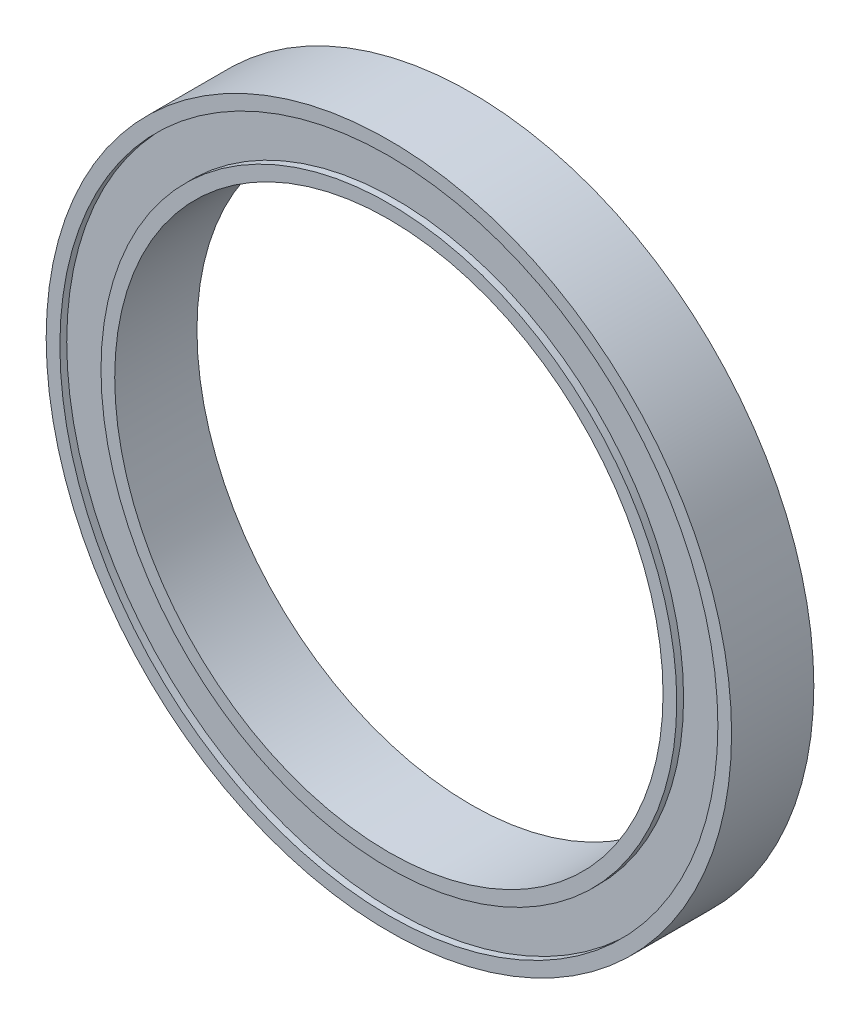
ISO-10303-21;
HEADER;
FILE_DESCRIPTION(('STEP AP214'),'2;1');
FILE_NAME('part.step','',(''),(''),'','','');
FILE_SCHEMA(('AUTOMOTIVE_DESIGN { 1 0 10303 214 1 1 1 1 }'));
ENDSEC;
DATA;
#1=APPLICATION_CONTEXT('core data for automotive mechanical design processes');
#2=APPLICATION_PROTOCOL_DEFINITION('international standard','automotive_design',2000,#1);
#3=PRODUCT_CONTEXT('',#1,'mechanical');
#4=PRODUCT('Part','Part','',(#3));
#5=PRODUCT_RELATED_PRODUCT_CATEGORY('part','',(#4));
#6=PRODUCT_DEFINITION_FORMATION('','',#4);
#7=PRODUCT_DEFINITION_CONTEXT('part definition',#1,'design');
#8=PRODUCT_DEFINITION('design','',#6,#7);
#9=PRODUCT_DEFINITION_SHAPE('','',#8);
#10=(LENGTH_UNIT() NAMED_UNIT(*) SI_UNIT(.MILLI.,.METRE.));
#11=(NAMED_UNIT(*) PLANE_ANGLE_UNIT() SI_UNIT($,.RADIAN.));
#12=(NAMED_UNIT(*) SI_UNIT($,.STERADIAN.) SOLID_ANGLE_UNIT());
#13=UNCERTAINTY_MEASURE_WITH_UNIT(LENGTH_MEASURE(1.E-05),#10,'distance_accuracy_value','');
#14=(GEOMETRIC_REPRESENTATION_CONTEXT(3) GLOBAL_UNCERTAINTY_ASSIGNED_CONTEXT((#13)) GLOBAL_UNIT_ASSIGNED_CONTEXT((#10,
#11,#12)) REPRESENTATION_CONTEXT('',''));
#15=CARTESIAN_POINT('',(0.,0.,0.));
#16=DIRECTION('',(0.,0.,1.));
#17=DIRECTION('',(1.,0.,0.));
#18=AXIS2_PLACEMENT_3D('',#15,#16,#17);
#19=CARTESIAN_POINT('',(0.,20.,-3.));
#20=DIRECTION('',(0.,0.,1.));
#21=DIRECTION('',(1.,0.,0.));
#22=AXIS2_PLACEMENT_3D('',#19,#20,#21);
#23=PLANE('',#22);
#24=CARTESIAN_POINT('',(0.,0.,-3.));
#25=DIRECTION('',(0.,0.,1.));
#26=DIRECTION('',(1.,0.,0.));
#27=AXIS2_PLACEMENT_3D('',#24,#25,#26);
#28=CIRCLE('',#27,25.);
#29=CARTESIAN_POINT('',(25.,0.,-3.));
#30=VERTEX_POINT('',#29);
#31=EDGE_CURVE('E66',#30,#30,#28,.T.);
#32=ORIENTED_EDGE('',*,*,#31,.F.);
#33=EDGE_LOOP('',(#32));
#34=FACE_BOUND('',#33,.T.);
#35=CARTESIAN_POINT('',(0.,0.,-3.));
#36=DIRECTION('',(0.,0.,1.));
#37=DIRECTION('',(1.,0.,0.));
#38=AXIS2_PLACEMENT_3D('',#35,#36,#37);
#39=CIRCLE('',#38,24.);
#40=CARTESIAN_POINT('',(24.,0.,-3.));
#41=VERTEX_POINT('',#40);
#42=EDGE_CURVE('E72',#41,#41,#39,.T.);
#43=ORIENTED_EDGE('',*,*,#42,.T.);
#44=EDGE_LOOP('',(#43));
#45=FACE_BOUND('',#44,.T.);
#46=ADVANCED_FACE('F47',(#34,#45),#23,.F.);
#47=CARTESIAN_POINT('',(0.,20.,3.));
#48=DIRECTION('',(0.,0.,-1.));
#49=DIRECTION('',(-1.,0.,0.));
#50=AXIS2_PLACEMENT_3D('',#47,#48,#49);
#51=PLANE('',#50);
#52=CARTESIAN_POINT('',(0.,0.,3.));
#53=DIRECTION('',(0.,0.,1.));
#54=DIRECTION('',(1.,0.,0.));
#55=AXIS2_PLACEMENT_3D('',#52,#53,#54);
#56=CIRCLE('',#55,25.);
#57=CARTESIAN_POINT('',(25.,0.,3.));
#58=VERTEX_POINT('',#57);
#59=EDGE_CURVE('E60',#58,#58,#56,.T.);
#60=ORIENTED_EDGE('',*,*,#59,.T.);
#61=EDGE_LOOP('',(#60));
#62=FACE_BOUND('',#61,.T.);
#63=CARTESIAN_POINT('',(0.,0.,3.));
#64=DIRECTION('',(0.,0.,1.));
#65=DIRECTION('',(1.,0.,0.));
#66=AXIS2_PLACEMENT_3D('',#63,#64,#65);
#67=CIRCLE('',#66,24.);
#68=CARTESIAN_POINT('',(24.,0.,3.));
#69=VERTEX_POINT('',#68);
#70=EDGE_CURVE('E73',#69,#69,#67,.T.);
#71=ORIENTED_EDGE('',*,*,#70,.F.);
#72=EDGE_LOOP('',(#71));
#73=FACE_BOUND('',#72,.T.);
#74=ADVANCED_FACE('F118',(#62,#73),#51,.F.);
#75=CARTESIAN_POINT('',(0.,0.,0.));
#76=DIRECTION('',(0.,0.,1.));
#77=DIRECTION('',(1.,0.,0.));
#78=AXIS2_PLACEMENT_3D('',#75,#76,#77);
#79=CYLINDRICAL_SURFACE('',#78,25.);
#80=ORIENTED_EDGE('',*,*,#59,.F.);
#81=EDGE_LOOP('',(#80));
#82=FACE_BOUND('',#81,.T.);
#83=ORIENTED_EDGE('',*,*,#31,.T.);
#84=EDGE_LOOP('',(#83));
#85=FACE_BOUND('',#84,.T.);
#86=ADVANCED_FACE('F123',(#82,#85),#79,.T.);
#87=CARTESIAN_POINT('',(0.,0.,0.));
#88=DIRECTION('',(0.,0.,1.));
#89=DIRECTION('',(1.,0.,0.));
#90=AXIS2_PLACEMENT_3D('',#87,#88,#89);
#91=CYLINDRICAL_SURFACE('',#90,24.);
#92=ORIENTED_EDGE('',*,*,#70,.T.);
#93=EDGE_LOOP('',(#92));
#94=FACE_BOUND('',#93,.T.);
#95=CARTESIAN_POINT('',(0.,0.,2.5));
#96=DIRECTION('',(0.,0.,1.));
#97=DIRECTION('',(1.,0.,0.));
#98=AXIS2_PLACEMENT_3D('',#95,#96,#97);
#99=CIRCLE('',#98,24.);
#100=CARTESIAN_POINT('',(24.,0.,2.5));
#101=VERTEX_POINT('',#100);
#102=EDGE_CURVE('E78',#101,#101,#99,.T.);
#103=ORIENTED_EDGE('',*,*,#102,.F.);
#104=EDGE_LOOP('',(#103));
#105=FACE_BOUND('',#104,.T.);
#106=ADVANCED_FACE('F145',(#94,#105),#91,.F.);
#107=CARTESIAN_POINT('',(0.,24.,2.5));
#108=DIRECTION('',(0.,0.,1.));
#109=DIRECTION('',(1.,0.,0.));
#110=AXIS2_PLACEMENT_3D('',#107,#108,#109);
#111=PLANE('',#110);
#112=ORIENTED_EDGE('',*,*,#102,.T.);
#113=EDGE_LOOP('',(#112));
#114=FACE_BOUND('',#113,.T.);
#115=CARTESIAN_POINT('',(0.,0.,2.5));
#116=DIRECTION('',(0.,0.,1.));
#117=DIRECTION('',(1.,0.,0.));
#118=AXIS2_PLACEMENT_3D('',#115,#116,#117);
#119=CIRCLE('',#118,21.);
#120=CARTESIAN_POINT('',(21.,0.,2.5));
#121=VERTEX_POINT('',#120);
#122=EDGE_CURVE('E82',#121,#121,#119,.T.);
#123=ORIENTED_EDGE('',*,*,#122,.F.);
#124=EDGE_LOOP('',(#123));
#125=FACE_BOUND('',#124,.T.);
#126=ADVANCED_FACE('F139',(#114,#125),#111,.T.);
#127=CARTESIAN_POINT('',(0.,0.,0.));
#128=DIRECTION('',(0.,0.,1.));
#129=DIRECTION('',(1.,0.,0.));
#130=AXIS2_PLACEMENT_3D('',#127,#128,#129);
#131=CYLINDRICAL_SURFACE('',#130,21.);
#132=ORIENTED_EDGE('',*,*,#122,.T.);
#133=EDGE_LOOP('',(#132));
#134=FACE_BOUND('',#133,.T.);
#135=CARTESIAN_POINT('',(0.,0.,3.));
#136=DIRECTION('',(0.,0.,1.));
#137=DIRECTION('',(1.,0.,0.));
#138=AXIS2_PLACEMENT_3D('',#135,#136,#137);
#139=CIRCLE('',#138,21.);
#140=CARTESIAN_POINT('',(21.,0.,3.));
#141=VERTEX_POINT('',#140);
#142=EDGE_CURVE('E85',#141,#141,#139,.T.);
#143=ORIENTED_EDGE('',*,*,#142,.F.);
#144=EDGE_LOOP('',(#143));
#145=FACE_BOUND('',#144,.T.);
#146=ADVANCED_FACE('F131',(#134,#145),#131,.T.);
#147=CARTESIAN_POINT('',(0.,0.,0.));
#148=DIRECTION('',(0.,0.,1.));
#149=DIRECTION('',(1.,0.,0.));
#150=AXIS2_PLACEMENT_3D('',#147,#148,#149);
#151=CYLINDRICAL_SURFACE('',#150,24.);
#152=CARTESIAN_POINT('',(0.,0.,-2.5));
#153=DIRECTION('',(0.,0.,1.));
#154=DIRECTION('',(1.,0.,0.));
#155=AXIS2_PLACEMENT_3D('',#152,#153,#154);
#156=CIRCLE('',#155,24.);
#157=CARTESIAN_POINT('',(24.,0.,-2.5));
#158=VERTEX_POINT('',#157);
#159=EDGE_CURVE('E92',#158,#158,#156,.T.);
#160=ORIENTED_EDGE('',*,*,#159,.T.);
#161=EDGE_LOOP('',(#160));
#162=FACE_BOUND('',#161,.T.);
#163=ORIENTED_EDGE('',*,*,#42,.F.);
#164=EDGE_LOOP('',(#163));
#165=FACE_BOUND('',#164,.T.);
#166=ADVANCED_FACE('F130',(#162,#165),#151,.F.);
#167=CARTESIAN_POINT('',(0.,24.,-2.5));
#168=DIRECTION('',(0.,0.,-1.));
#169=DIRECTION('',(-1.,0.,0.));
#170=AXIS2_PLACEMENT_3D('',#167,#168,#169);
#171=PLANE('',#170);
#172=CARTESIAN_POINT('',(0.,0.,-2.5));
#173=DIRECTION('',(0.,0.,1.));
#174=DIRECTION('',(1.,0.,0.));
#175=AXIS2_PLACEMENT_3D('',#172,#173,#174);
#176=CIRCLE('',#175,21.);
#177=CARTESIAN_POINT('',(21.,0.,-2.5));
#178=VERTEX_POINT('',#177);
#179=EDGE_CURVE('E96',#178,#178,#176,.T.);
#180=ORIENTED_EDGE('',*,*,#179,.T.);
#181=EDGE_LOOP('',(#180));
#182=FACE_BOUND('',#181,.T.);
#183=ORIENTED_EDGE('',*,*,#159,.F.);
#184=EDGE_LOOP('',(#183));
#185=FACE_BOUND('',#184,.T.);
#186=ADVANCED_FACE('F115',(#182,#185),#171,.T.);
#187=CARTESIAN_POINT('',(0.,0.,0.));
#188=DIRECTION('',(0.,0.,1.));
#189=DIRECTION('',(1.,0.,0.));
#190=AXIS2_PLACEMENT_3D('',#187,#188,#189);
#191=CYLINDRICAL_SURFACE('',#190,21.);
#192=CARTESIAN_POINT('',(0.,0.,-3.));
#193=DIRECTION('',(0.,0.,1.));
#194=DIRECTION('',(1.,0.,0.));
#195=AXIS2_PLACEMENT_3D('',#192,#193,#194);
#196=CIRCLE('',#195,21.);
#197=CARTESIAN_POINT('',(21.,0.,-3.));
#198=VERTEX_POINT('',#197);
#199=EDGE_CURVE('E77',#198,#198,#196,.T.);
#200=ORIENTED_EDGE('',*,*,#199,.T.);
#201=EDGE_LOOP('',(#200));
#202=FACE_BOUND('',#201,.T.);
#203=ORIENTED_EDGE('',*,*,#179,.F.);
#204=EDGE_LOOP('',(#203));
#205=FACE_BOUND('',#204,.T.);
#206=ADVANCED_FACE('F103',(#202,#205),#191,.T.);
#207=CARTESIAN_POINT('',(0.,0.,-3.));
#208=DIRECTION('',(0.,0.,1.));
#209=DIRECTION('',(1.,0.,0.));
#210=AXIS2_PLACEMENT_3D('',#207,#208,#209);
#211=CIRCLE('',#210,20.);
#212=CARTESIAN_POINT('',(20.,0.,-3.));
#213=VERTEX_POINT('',#212);
#214=EDGE_CURVE('E10',#213,#213,#211,.T.);
#215=ORIENTED_EDGE('',*,*,#214,.T.);
#216=EDGE_LOOP('',(#215));
#217=FACE_BOUND('',#216,.T.);
#218=ORIENTED_EDGE('',*,*,#199,.F.);
#219=EDGE_LOOP('',(#218));
#220=FACE_BOUND('',#219,.T.);
#221=ADVANCED_FACE('F106',(#217,#220),#23,.F.);
#222=CARTESIAN_POINT('',(0.,0.,0.));
#223=DIRECTION('',(0.,0.,1.));
#224=DIRECTION('',(1.,0.,0.));
#225=AXIS2_PLACEMENT_3D('',#222,#223,#224);
#226=CYLINDRICAL_SURFACE('',#225,20.);
#227=ORIENTED_EDGE('',*,*,#214,.F.);
#228=EDGE_LOOP('',(#227));
#229=FACE_BOUND('',#228,.T.);
#230=CARTESIAN_POINT('',(0.,0.,3.));
#231=DIRECTION('',(0.,0.,1.));
#232=DIRECTION('',(1.,0.,0.));
#233=AXIS2_PLACEMENT_3D('',#230,#231,#232);
#234=CIRCLE('',#233,20.);
#235=CARTESIAN_POINT('',(20.,0.,3.));
#236=VERTEX_POINT('',#235);
#237=EDGE_CURVE('E54',#236,#236,#234,.T.);
#238=ORIENTED_EDGE('',*,*,#237,.T.);
#239=EDGE_LOOP('',(#238));
#240=FACE_BOUND('',#239,.T.);
#241=ADVANCED_FACE('F108',(#229,#240),#226,.F.);
#242=ORIENTED_EDGE('',*,*,#237,.F.);
#243=EDGE_LOOP('',(#242));
#244=FACE_BOUND('',#243,.T.);
#245=ORIENTED_EDGE('',*,*,#142,.T.);
#246=EDGE_LOOP('',(#245));
#247=FACE_BOUND('',#246,.T.);
#248=ADVANCED_FACE('F112',(#244,#247),#51,.F.);
#249=CLOSED_SHELL('',(#46,#74,#86,#106,#126,#146,#166,#186,#206,#221,#241,#248));
#250=MANIFOLD_SOLID_BREP('B2',#249);
#251=ADVANCED_BREP_SHAPE_REPRESENTATION('',(#18,#250),#14);
#252=SHAPE_DEFINITION_REPRESENTATION(#9,#251);
ENDSEC;
END-ISO-10303-21;
